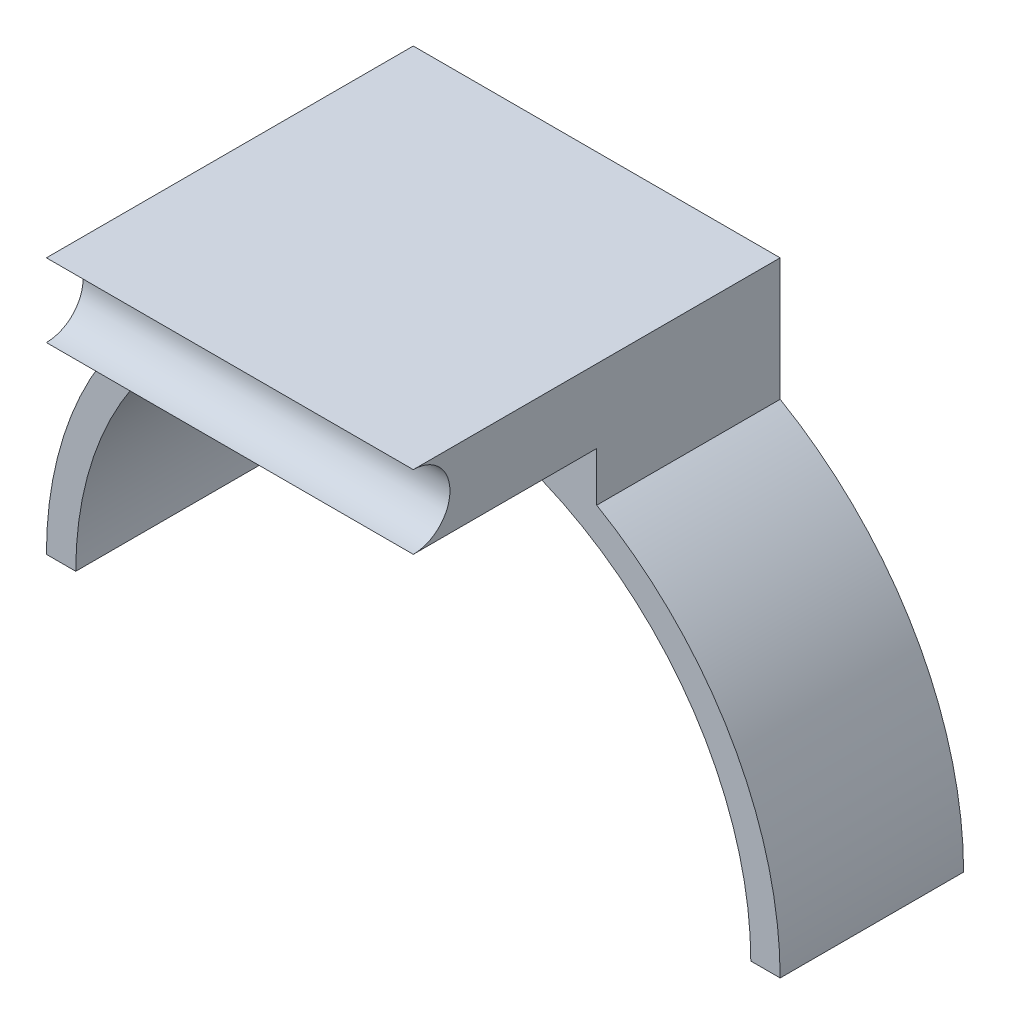
ISO-10303-21;
HEADER;
FILE_DESCRIPTION(('STEP AP214'),'2;1');
FILE_NAME('part.step','',(''),(''),'','','');
FILE_SCHEMA(('AUTOMOTIVE_DESIGN { 1 0 10303 214 1 1 1 1 }'));
ENDSEC;
DATA;
#1=APPLICATION_CONTEXT('core data for automotive mechanical design processes');
#2=APPLICATION_PROTOCOL_DEFINITION('international standard','automotive_design',2000,#1);
#3=PRODUCT_CONTEXT('',#1,'mechanical');
#4=PRODUCT('Part','Part','',(#3));
#5=PRODUCT_RELATED_PRODUCT_CATEGORY('part','',(#4));
#6=PRODUCT_DEFINITION_FORMATION('','',#4);
#7=PRODUCT_DEFINITION_CONTEXT('part definition',#1,'design');
#8=PRODUCT_DEFINITION('design','',#6,#7);
#9=PRODUCT_DEFINITION_SHAPE('','',#8);
#10=(LENGTH_UNIT() NAMED_UNIT(*) SI_UNIT(.MILLI.,.METRE.));
#11=(NAMED_UNIT(*) PLANE_ANGLE_UNIT() SI_UNIT($,.RADIAN.));
#12=(NAMED_UNIT(*) SI_UNIT($,.STERADIAN.) SOLID_ANGLE_UNIT());
#13=UNCERTAINTY_MEASURE_WITH_UNIT(LENGTH_MEASURE(1.E-05),#10,'distance_accuracy_value','');
#14=(GEOMETRIC_REPRESENTATION_CONTEXT(3) GLOBAL_UNCERTAINTY_ASSIGNED_CONTEXT((#13)) GLOBAL_UNIT_ASSIGNED_CONTEXT((#10,
#11,#12)) REPRESENTATION_CONTEXT('',''));
#15=CARTESIAN_POINT('',(0.,0.,0.));
#16=DIRECTION('',(0.,0.,1.));
#17=DIRECTION('',(1.,0.,0.));
#18=AXIS2_PLACEMENT_3D('',#15,#16,#17);
#19=CARTESIAN_POINT('',(-25.,5.,50.));
#20=DIRECTION('',(1.,0.,0.));
#21=DIRECTION('',(0.,0.,-1.));
#22=AXIS2_PLACEMENT_3D('',#19,#20,#21);
#23=PLANE('',#22);
#24=DIRECTION('',(0.,0.,-1.));
#25=VECTOR('',#24,1.);
#26=CARTESIAN_POINT('',(-25.,-5.,50.));
#27=LINE('',#26,#25);
#28=CARTESIAN_POINT('',(-25.,-5.,50.));
#29=VERTEX_POINT('',#28);
#30=CARTESIAN_POINT('',(-25.,-5.,25.));
#31=VERTEX_POINT('',#30);
#32=EDGE_CURVE('E11',#29,#31,#27,.T.);
#33=ORIENTED_EDGE('',*,*,#32,.F.);
#34=CARTESIAN_POINT('',(-25.,0.,50.));
#35=DIRECTION('',(1.,0.,0.));
#36=DIRECTION('',(0.,0.,-1.));
#37=AXIS2_PLACEMENT_3D('',#34,#35,#36);
#38=CIRCLE('',#37,5.);
#39=CARTESIAN_POINT('',(-25.,5.,50.));
#40=VERTEX_POINT('',#39);
#41=EDGE_CURVE('E167',#29,#40,#38,.T.);
#42=ORIENTED_EDGE('',*,*,#41,.T.);
#43=DIRECTION('',(0.,0.,-1.));
#44=VECTOR('',#43,1.);
#45=CARTESIAN_POINT('',(-25.,5.,50.));
#46=LINE('',#45,#44);
#47=CARTESIAN_POINT('',(-25.,5.,0.));
#48=VERTEX_POINT('',#47);
#49=EDGE_CURVE('E200',#40,#48,#46,.T.);
#50=ORIENTED_EDGE('',*,*,#49,.T.);
#51=DIRECTION('',(0.,-1.,0.));
#52=VECTOR('',#51,1.);
#53=CARTESIAN_POINT('',(-25.,5.,0.));
#54=LINE('',#53,#52);
#55=CARTESIAN_POINT('',(-25.,-11.6987298107781,0.));
#56=VERTEX_POINT('',#55);
#57=EDGE_CURVE('E183',#48,#56,#54,.T.);
#58=ORIENTED_EDGE('',*,*,#57,.T.);
#59=DIRECTION('',(0.,0.,-1.));
#60=VECTOR('',#59,1.);
#61=CARTESIAN_POINT('',(-25.,-11.6987298107781,25.));
#62=LINE('',#61,#60);
#63=CARTESIAN_POINT('',(-25.,-11.6987298107781,25.));
#64=VERTEX_POINT('',#63);
#65=EDGE_CURVE('E120',#64,#56,#62,.T.);
#66=ORIENTED_EDGE('',*,*,#65,.F.);
#67=DIRECTION('',(0.,1.,0.));
#68=VECTOR('',#67,1.);
#69=CARTESIAN_POINT('',(-25.,-5.,25.));
#70=LINE('',#69,#68);
#71=EDGE_CURVE('E236',#64,#31,#70,.T.);
#72=ORIENTED_EDGE('',*,*,#71,.T.);
#73=EDGE_LOOP('',(#33,#42,#50,#58,#66,#72));
#74=FACE_BOUND('',#73,.T.);
#75=ADVANCED_FACE('F39',(#74),#23,.F.);
#76=CARTESIAN_POINT('',(-25.,-5.,50.));
#77=DIRECTION('',(0.,1.,0.));
#78=DIRECTION('',(0.,0.,1.));
#79=AXIS2_PLACEMENT_3D('',#76,#77,#78);
#80=PLANE('',#79);
#81=ORIENTED_EDGE('',*,*,#32,.T.);
#82=DIRECTION('',(1.,0.,0.));
#83=VECTOR('',#82,1.);
#84=CARTESIAN_POINT('',(25.,-5.,25.));
#85=LINE('',#84,#83);
#86=CARTESIAN_POINT('',(25.,-5.,25.));
#87=VERTEX_POINT('',#86);
#88=EDGE_CURVE('E221',#31,#87,#85,.T.);
#89=ORIENTED_EDGE('',*,*,#88,.T.);
#90=DIRECTION('',(0.,0.,-1.));
#91=VECTOR('',#90,1.);
#92=CARTESIAN_POINT('',(25.,-5.,50.));
#93=LINE('',#92,#91);
#94=CARTESIAN_POINT('',(25.,-5.,50.));
#95=VERTEX_POINT('',#94);
#96=EDGE_CURVE('E47',#95,#87,#93,.T.);
#97=ORIENTED_EDGE('',*,*,#96,.F.);
#98=DIRECTION('',(1.,0.,0.));
#99=VECTOR('',#98,1.);
#100=CARTESIAN_POINT('',(-25.,-5.,50.));
#101=LINE('',#100,#99);
#102=EDGE_CURVE('E193',#29,#95,#101,.T.);
#103=ORIENTED_EDGE('',*,*,#102,.F.);
#104=EDGE_LOOP('',(#81,#89,#97,#103));
#105=FACE_BOUND('',#104,.T.);
#106=ADVANCED_FACE('F219',(#105),#80,.F.);
#107=CARTESIAN_POINT('',(25.,5.,50.));
#108=DIRECTION('',(-1.,0.,0.));
#109=DIRECTION('',(0.,0.,1.));
#110=AXIS2_PLACEMENT_3D('',#107,#108,#109);
#111=PLANE('',#110);
#112=DIRECTION('',(0.,0.,-1.));
#113=VECTOR('',#112,1.);
#114=CARTESIAN_POINT('',(25.,5.,50.));
#115=LINE('',#114,#113);
#116=CARTESIAN_POINT('',(25.,5.,50.));
#117=VERTEX_POINT('',#116);
#118=CARTESIAN_POINT('',(25.,5.,0.));
#119=VERTEX_POINT('',#118);
#120=EDGE_CURVE('E210',#117,#119,#115,.T.);
#121=ORIENTED_EDGE('',*,*,#120,.F.);
#122=CARTESIAN_POINT('',(25.,0.,50.));
#123=DIRECTION('',(1.,0.,0.));
#124=DIRECTION('',(0.,0.,-1.));
#125=AXIS2_PLACEMENT_3D('',#122,#123,#124);
#126=CIRCLE('',#125,5.);
#127=EDGE_CURVE('E63',#95,#117,#126,.T.);
#128=ORIENTED_EDGE('',*,*,#127,.F.);
#129=ORIENTED_EDGE('',*,*,#96,.T.);
#130=DIRECTION('',(0.,-1.,0.));
#131=VECTOR('',#130,1.);
#132=CARTESIAN_POINT('',(25.,-5.,25.));
#133=LINE('',#132,#131);
#134=CARTESIAN_POINT('',(25.,-11.6987298107781,25.));
#135=VERTEX_POINT('',#134);
#136=EDGE_CURVE('E54',#87,#135,#133,.T.);
#137=ORIENTED_EDGE('',*,*,#136,.T.);
#138=DIRECTION('',(0.,0.,-1.));
#139=VECTOR('',#138,1.);
#140=CARTESIAN_POINT('',(25.,-11.6987298107781,25.));
#141=LINE('',#140,#139);
#142=CARTESIAN_POINT('',(25.,-11.6987298107781,0.));
#143=VERTEX_POINT('',#142);
#144=EDGE_CURVE('E188',#135,#143,#141,.T.);
#145=ORIENTED_EDGE('',*,*,#144,.T.);
#146=DIRECTION('',(0.,1.,0.));
#147=VECTOR('',#146,1.);
#148=CARTESIAN_POINT('',(25.,5.,0.));
#149=LINE('',#148,#147);
#150=EDGE_CURVE('E76',#143,#119,#149,.T.);
#151=ORIENTED_EDGE('',*,*,#150,.T.);
#152=EDGE_LOOP('',(#121,#128,#129,#137,#145,#151));
#153=FACE_BOUND('',#152,.T.);
#154=ADVANCED_FACE('F215',(#153),#111,.F.);
#155=CARTESIAN_POINT('',(-25.,5.,50.));
#156=DIRECTION('',(0.,-1.,0.));
#157=DIRECTION('',(0.,0.,-1.));
#158=AXIS2_PLACEMENT_3D('',#155,#156,#157);
#159=PLANE('',#158);
#160=DIRECTION('',(-1.,0.,0.));
#161=VECTOR('',#160,1.);
#162=CARTESIAN_POINT('',(-25.,5.,0.));
#163=LINE('',#162,#161);
#164=EDGE_CURVE('E197',#119,#48,#163,.T.);
#165=ORIENTED_EDGE('',*,*,#164,.T.);
#166=ORIENTED_EDGE('',*,*,#49,.F.);
#167=DIRECTION('',(-1.,0.,0.));
#168=VECTOR('',#167,1.);
#169=CARTESIAN_POINT('',(-25.,5.,50.));
#170=LINE('',#169,#168);
#171=EDGE_CURVE('E196',#117,#40,#170,.T.);
#172=ORIENTED_EDGE('',*,*,#171,.F.);
#173=ORIENTED_EDGE('',*,*,#120,.T.);
#174=EDGE_LOOP('',(#165,#166,#172,#173));
#175=FACE_BOUND('',#174,.T.);
#176=ADVANCED_FACE('F263',(#175),#159,.F.);
#177=CARTESIAN_POINT('',(0.,0.,0.));
#178=DIRECTION('',(0.,0.,1.));
#179=DIRECTION('',(1.,0.,0.));
#180=AXIS2_PLACEMENT_3D('',#177,#178,#179);
#181=PLANE('',#180);
#182=ORIENTED_EDGE('',*,*,#57,.F.);
#183=ORIENTED_EDGE('',*,*,#164,.F.);
#184=ORIENTED_EDGE('',*,*,#150,.F.);
#185=CARTESIAN_POINT('',(0.,-55.,0.));
#186=DIRECTION('',(0.,0.,-1.));
#187=DIRECTION('',(-1.,0.,0.));
#188=AXIS2_PLACEMENT_3D('',#185,#186,#187);
#189=CIRCLE('',#188,50.);
#190=CARTESIAN_POINT('',(50.,-55.0000000000003,0.));
#191=VERTEX_POINT('',#190);
#192=EDGE_CURVE('E166',#143,#191,#189,.T.);
#193=ORIENTED_EDGE('',*,*,#192,.T.);
#194=DIRECTION('',(-1.,0.,0.));
#195=VECTOR('',#194,1.);
#196=CARTESIAN_POINT('',(46.,-55.0000000000003,0.));
#197=LINE('',#196,#195);
#198=CARTESIAN_POINT('',(46.,-55.0000000000003,0.));
#199=VERTEX_POINT('',#198);
#200=EDGE_CURVE('E171',#191,#199,#197,.T.);
#201=ORIENTED_EDGE('',*,*,#200,.T.);
#202=CARTESIAN_POINT('',(0.,-55.,0.));
#203=DIRECTION('',(0.,0.,1.));
#204=DIRECTION('',(-1.,0.,0.));
#205=AXIS2_PLACEMENT_3D('',#202,#203,#204);
#206=CIRCLE('',#205,46.);
#207=CARTESIAN_POINT('',(-46.,-55.,0.));
#208=VERTEX_POINT('',#207);
#209=EDGE_CURVE('E137',#199,#208,#206,.T.);
#210=ORIENTED_EDGE('',*,*,#209,.T.);
#211=DIRECTION('',(-1.,0.,0.));
#212=VECTOR('',#211,1.);
#213=CARTESIAN_POINT('',(-46.,-55.,0.));
#214=LINE('',#213,#212);
#215=CARTESIAN_POINT('',(-50.,-55.,0.));
#216=VERTEX_POINT('',#215);
#217=EDGE_CURVE('E176',#208,#216,#214,.T.);
#218=ORIENTED_EDGE('',*,*,#217,.T.);
#219=CARTESIAN_POINT('',(0.,-55.,0.));
#220=DIRECTION('',(0.,0.,-1.));
#221=DIRECTION('',(-1.,0.,0.));
#222=AXIS2_PLACEMENT_3D('',#219,#220,#221);
#223=CIRCLE('',#222,50.);
#224=EDGE_CURVE('E162',#216,#56,#223,.T.);
#225=ORIENTED_EDGE('',*,*,#224,.T.);
#226=EDGE_LOOP('',(#182,#183,#184,#193,#201,#210,#218,#225));
#227=FACE_BOUND('',#226,.T.);
#228=ADVANCED_FACE('F244',(#227),#181,.F.);
#229=CARTESIAN_POINT('',(0.,-55.,25.));
#230=DIRECTION('',(0.,0.,-1.));
#231=DIRECTION('',(-1.,0.,0.));
#232=AXIS2_PLACEMENT_3D('',#229,#230,#231);
#233=CYLINDRICAL_SURFACE('',#232,50.);
#234=ORIENTED_EDGE('',*,*,#224,.F.);
#235=DIRECTION('',(0.,0.,-1.));
#236=VECTOR('',#235,1.);
#237=CARTESIAN_POINT('',(-50.,-55.,25.));
#238=LINE('',#237,#236);
#239=CARTESIAN_POINT('',(-50.,-55.,25.));
#240=VERTEX_POINT('',#239);
#241=EDGE_CURVE('E85',#240,#216,#238,.T.);
#242=ORIENTED_EDGE('',*,*,#241,.F.);
#243=CARTESIAN_POINT('',(0.,-55.,25.));
#244=DIRECTION('',(0.,0.,-1.));
#245=DIRECTION('',(-1.,0.,0.));
#246=AXIS2_PLACEMENT_3D('',#243,#244,#245);
#247=CIRCLE('',#246,50.);
#248=EDGE_CURVE('E180',#240,#64,#247,.T.);
#249=ORIENTED_EDGE('',*,*,#248,.T.);
#250=ORIENTED_EDGE('',*,*,#65,.T.);
#251=EDGE_LOOP('',(#234,#242,#249,#250));
#252=FACE_BOUND('',#251,.T.);
#253=ADVANCED_FACE('F241',(#252),#233,.T.);
#254=CARTESIAN_POINT('',(-46.,-55.,25.));
#255=DIRECTION('',(0.,-1.,0.));
#256=DIRECTION('',(0.,0.,-1.));
#257=AXIS2_PLACEMENT_3D('',#254,#255,#256);
#258=PLANE('',#257);
#259=ORIENTED_EDGE('',*,*,#217,.F.);
#260=DIRECTION('',(0.,0.,-1.));
#261=VECTOR('',#260,1.);
#262=CARTESIAN_POINT('',(-46.,-55.,25.));
#263=LINE('',#262,#261);
#264=CARTESIAN_POINT('',(-46.,-55.,25.));
#265=VERTEX_POINT('',#264);
#266=EDGE_CURVE('E108',#265,#208,#263,.T.);
#267=ORIENTED_EDGE('',*,*,#266,.F.);
#268=DIRECTION('',(-1.,0.,0.));
#269=VECTOR('',#268,1.);
#270=CARTESIAN_POINT('',(-46.,-55.,25.));
#271=LINE('',#270,#269);
#272=EDGE_CURVE('E149',#265,#240,#271,.T.);
#273=ORIENTED_EDGE('',*,*,#272,.T.);
#274=ORIENTED_EDGE('',*,*,#241,.T.);
#275=EDGE_LOOP('',(#259,#267,#273,#274));
#276=FACE_BOUND('',#275,.T.);
#277=ADVANCED_FACE('F246',(#276),#258,.T.);
#278=CARTESIAN_POINT('',(0.,-55.,25.));
#279=DIRECTION('',(0.,0.,-1.));
#280=DIRECTION('',(-1.,0.,0.));
#281=AXIS2_PLACEMENT_3D('',#278,#279,#280);
#282=CYLINDRICAL_SURFACE('',#281,46.);
#283=ORIENTED_EDGE('',*,*,#209,.F.);
#284=DIRECTION('',(0.,0.,-1.));
#285=VECTOR('',#284,1.);
#286=CARTESIAN_POINT('',(46.,-55.0000000000003,25.));
#287=LINE('',#286,#285);
#288=CARTESIAN_POINT('',(46.,-55.0000000000003,25.));
#289=VERTEX_POINT('',#288);
#290=EDGE_CURVE('E132',#289,#199,#287,.T.);
#291=ORIENTED_EDGE('',*,*,#290,.F.);
#292=CARTESIAN_POINT('',(0.,-55.,25.));
#293=DIRECTION('',(0.,0.,1.));
#294=DIRECTION('',(-1.,0.,0.));
#295=AXIS2_PLACEMENT_3D('',#292,#293,#294);
#296=CIRCLE('',#295,46.);
#297=EDGE_CURVE('E135',#289,#265,#296,.T.);
#298=ORIENTED_EDGE('',*,*,#297,.T.);
#299=ORIENTED_EDGE('',*,*,#266,.T.);
#300=EDGE_LOOP('',(#283,#291,#298,#299));
#301=FACE_BOUND('',#300,.T.);
#302=ADVANCED_FACE('F134',(#301),#282,.F.);
#303=CARTESIAN_POINT('',(46.,-55.0000000000003,25.));
#304=DIRECTION('',(0.,-1.,0.));
#305=DIRECTION('',(1.,0.,0.));
#306=AXIS2_PLACEMENT_3D('',#303,#304,#305);
#307=PLANE('',#306);
#308=ORIENTED_EDGE('',*,*,#200,.F.);
#309=DIRECTION('',(0.,0.,-1.));
#310=VECTOR('',#309,1.);
#311=CARTESIAN_POINT('',(50.,-55.0000000000003,25.));
#312=LINE('',#311,#310);
#313=CARTESIAN_POINT('',(50.,-55.0000000000003,25.));
#314=VERTEX_POINT('',#313);
#315=EDGE_CURVE('E143',#314,#191,#312,.T.);
#316=ORIENTED_EDGE('',*,*,#315,.F.);
#317=DIRECTION('',(-1.,0.,0.));
#318=VECTOR('',#317,1.);
#319=CARTESIAN_POINT('',(46.,-55.0000000000003,25.));
#320=LINE('',#319,#318);
#321=EDGE_CURVE('E147',#314,#289,#320,.T.);
#322=ORIENTED_EDGE('',*,*,#321,.T.);
#323=ORIENTED_EDGE('',*,*,#290,.T.);
#324=EDGE_LOOP('',(#308,#316,#322,#323));
#325=FACE_BOUND('',#324,.T.);
#326=ADVANCED_FACE('F152',(#325),#307,.T.);
#327=CARTESIAN_POINT('',(0.,-55.,25.));
#328=DIRECTION('',(0.,0.,-1.));
#329=DIRECTION('',(-1.,0.,0.));
#330=AXIS2_PLACEMENT_3D('',#327,#328,#329);
#331=CYLINDRICAL_SURFACE('',#330,50.);
#332=ORIENTED_EDGE('',*,*,#192,.F.);
#333=ORIENTED_EDGE('',*,*,#144,.F.);
#334=CARTESIAN_POINT('',(0.,-55.,25.));
#335=DIRECTION('',(0.,0.,-1.));
#336=DIRECTION('',(-1.,0.,0.));
#337=AXIS2_PLACEMENT_3D('',#334,#335,#336);
#338=CIRCLE('',#337,50.);
#339=EDGE_CURVE('E154',#135,#314,#338,.T.);
#340=ORIENTED_EDGE('',*,*,#339,.T.);
#341=ORIENTED_EDGE('',*,*,#315,.T.);
#342=EDGE_LOOP('',(#332,#333,#340,#341));
#343=FACE_BOUND('',#342,.T.);
#344=ADVANCED_FACE('F271',(#343),#331,.T.);
#345=CARTESIAN_POINT('',(0.,-55.,25.));
#346=DIRECTION('',(0.,0.,-1.));
#347=DIRECTION('',(-1.,0.,0.));
#348=AXIS2_PLACEMENT_3D('',#345,#346,#347);
#349=PLANE('',#348);
#350=ORIENTED_EDGE('',*,*,#248,.F.);
#351=ORIENTED_EDGE('',*,*,#272,.F.);
#352=ORIENTED_EDGE('',*,*,#297,.F.);
#353=ORIENTED_EDGE('',*,*,#321,.F.);
#354=ORIENTED_EDGE('',*,*,#339,.F.);
#355=ORIENTED_EDGE('',*,*,#136,.F.);
#356=ORIENTED_EDGE('',*,*,#88,.F.);
#357=ORIENTED_EDGE('',*,*,#71,.F.);
#358=EDGE_LOOP('',(#350,#351,#352,#353,#354,#355,#356,#357));
#359=FACE_BOUND('',#358,.T.);
#360=ADVANCED_FACE('F146',(#359),#349,.F.);
#361=CARTESIAN_POINT('',(-50.,0.,50.));
#362=DIRECTION('',(1.,0.,0.));
#363=DIRECTION('',(0.,0.,-1.));
#364=AXIS2_PLACEMENT_3D('',#361,#362,#363);
#365=CYLINDRICAL_SURFACE('',#364,5.);
#366=ORIENTED_EDGE('',*,*,#102,.T.);
#367=ORIENTED_EDGE('',*,*,#127,.T.);
#368=ORIENTED_EDGE('',*,*,#171,.T.);
#369=ORIENTED_EDGE('',*,*,#41,.F.);
#370=EDGE_LOOP('',(#366,#367,#368,#369));
#371=FACE_BOUND('',#370,.T.);
#372=ADVANCED_FACE('F227',(#371),#365,.F.);
#373=CLOSED_SHELL('',(#75,#106,#154,#176,#228,#253,#277,#302,#326,#344,#360,#372));
#374=MANIFOLD_SOLID_BREP('B2',#373);
#375=ADVANCED_BREP_SHAPE_REPRESENTATION('',(#18,#374),#14);
#376=SHAPE_DEFINITION_REPRESENTATION(#9,#375);
ENDSEC;
END-ISO-10303-21;
